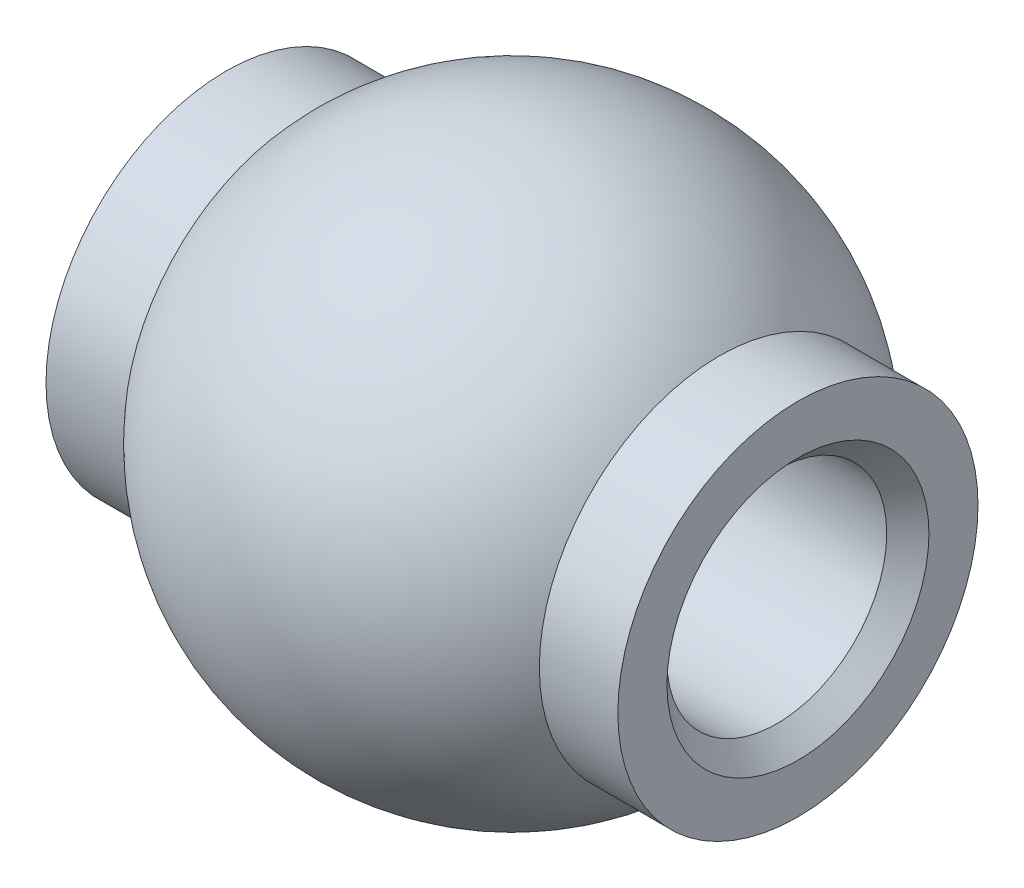
ISO-10303-21;
HEADER;
FILE_DESCRIPTION(('STEP AP214'),'2;1');
FILE_NAME('part.step','',(''),(''),'','','');
FILE_SCHEMA(('AUTOMOTIVE_DESIGN { 1 0 10303 214 1 1 1 1 }'));
ENDSEC;
DATA;
#1=APPLICATION_CONTEXT('core data for automotive mechanical design processes');
#2=APPLICATION_PROTOCOL_DEFINITION('international standard','automotive_design',2000,#1);
#3=PRODUCT_CONTEXT('',#1,'mechanical');
#4=PRODUCT('Part','Part','',(#3));
#5=PRODUCT_RELATED_PRODUCT_CATEGORY('part','',(#4));
#6=PRODUCT_DEFINITION_FORMATION('','',#4);
#7=PRODUCT_DEFINITION_CONTEXT('part definition',#1,'design');
#8=PRODUCT_DEFINITION('design','',#6,#7);
#9=PRODUCT_DEFINITION_SHAPE('','',#8);
#10=(LENGTH_UNIT() NAMED_UNIT(*) SI_UNIT(.MILLI.,.METRE.));
#11=(NAMED_UNIT(*) PLANE_ANGLE_UNIT() SI_UNIT($,.RADIAN.));
#12=(NAMED_UNIT(*) SI_UNIT($,.STERADIAN.) SOLID_ANGLE_UNIT());
#13=UNCERTAINTY_MEASURE_WITH_UNIT(LENGTH_MEASURE(1.E-05),#10,'distance_accuracy_value','');
#14=(GEOMETRIC_REPRESENTATION_CONTEXT(3) GLOBAL_UNCERTAINTY_ASSIGNED_CONTEXT((#13)) GLOBAL_UNIT_ASSIGNED_CONTEXT((#10,
#11,#12)) REPRESENTATION_CONTEXT('',''));
#15=CARTESIAN_POINT('',(0.,0.,0.));
#16=DIRECTION('',(0.,0.,1.));
#17=DIRECTION('',(1.,0.,0.));
#18=AXIS2_PLACEMENT_3D('',#15,#16,#17);
#19=CARTESIAN_POINT('',(-18.1576372828576,0.,0.));
#20=DIRECTION('',(-1.,0.,0.));
#21=DIRECTION('',(0.,0.,1.));
#22=AXIS2_PLACEMENT_3D('',#19,#20,#21);
#23=CYLINDRICAL_SURFACE('',#22,6.5024);
#24=CARTESIAN_POINT('',(-10.3251,0.,0.));
#25=DIRECTION('',(-1.,0.,0.));
#26=DIRECTION('',(0.,0.,1.));
#27=AXIS2_PLACEMENT_3D('',#24,#25,#26);
#28=CIRCLE('',#27,6.5024);
#29=CARTESIAN_POINT('',(-10.3251,0.,6.5024));
#30=VERTEX_POINT('',#29);
#31=EDGE_CURVE('E60',#30,#30,#28,.T.);
#32=ORIENTED_EDGE('',*,*,#31,.F.);
#33=EDGE_LOOP('',(#32));
#34=FACE_BOUND('',#33,.T.);
#35=CARTESIAN_POINT('',(-7.4899535332337,0.,0.));
#36=DIRECTION('',(-1.,0.,0.));
#37=DIRECTION('',(0.,0.,1.));
#38=AXIS2_PLACEMENT_3D('',#35,#36,#37);
#39=CIRCLE('',#38,6.5024);
#40=CARTESIAN_POINT('',(-7.4899535332337,6.5024,0.));
#41=VERTEX_POINT('',#40);
#42=EDGE_CURVE('E10',#41,#41,#39,.T.);
#43=ORIENTED_EDGE('',*,*,#42,.T.);
#44=EDGE_LOOP('',(#43));
#45=FACE_BOUND('',#44,.T.);
#46=ADVANCED_FACE('F32',(#34,#45),#23,.T.);
#47=CARTESIAN_POINT('',(0.,0.,0.));
#48=DIRECTION('',(-1.,0.,0.));
#49=DIRECTION('',(0.,1.,0.));
#50=AXIS2_PLACEMENT_3D('',#47,#48,#49);
#51=SPHERICAL_SURFACE('',#50,9.9187);
#52=CARTESIAN_POINT('',(7.4899535332337,0.,0.));
#53=DIRECTION('',(-1.,0.,0.));
#54=DIRECTION('',(0.,0.,1.));
#55=AXIS2_PLACEMENT_3D('',#52,#53,#54);
#56=CIRCLE('',#55,6.5024);
#57=CARTESIAN_POINT('',(7.4899535332337,6.5024,0.));
#58=VERTEX_POINT('',#57);
#59=EDGE_CURVE('E38',#58,#58,#56,.T.);
#60=CARTESIAN_POINT('',(-7.4899535332337,6.5024,0.));
#61=CARTESIAN_POINT('',(-7.37401661183817,6.63595227202198,0.));
#62=CARTESIAN_POINT('',(-7.25450093948191,6.76639705686018,0.));
#63=CARTESIAN_POINT('',(-7.00866932481816,7.02071332826354,0.));
#64=CARTESIAN_POINT('',(-6.88235338251067,7.1445848148287,0.));
#65=CARTESIAN_POINT('',(-6.62327845991468,7.38539616578054,0.));
#66=CARTESIAN_POINT('',(-6.49051947962619,7.50233603016721,0.));
#67=CARTESIAN_POINT('',(-6.21893935659771,7.72895068009894,0.));
#68=CARTESIAN_POINT('',(-6.08011821385773,7.83862546564399,0.));
#69=CARTESIAN_POINT('',(-5.79681058638008,8.05039593386584,0.));
#70=CARTESIAN_POINT('',(-5.65232410164241,8.15249161654265,0.));
#71=CARTESIAN_POINT('',(-5.35809919129269,8.34881189773743,0.));
#72=CARTESIAN_POINT('',(-5.20836076568064,8.44303649625542,0.));
#73=CARTESIAN_POINT('',(-4.90406029827689,8.62334504715407,0.));
#74=CARTESIAN_POINT('',(-4.74949825648517,8.70942899953474,0.));
#75=CARTESIAN_POINT('',(-4.43599270685566,8.87321000951006,0.));
#76=CARTESIAN_POINT('',(-4.27704919901786,8.95090706710471,0.));
#77=CARTESIAN_POINT('',(-3.95523539397332,9.09769202368348,0.));
#78=CARTESIAN_POINT('',(-3.79236509676657,9.1667799226676,0.));
#79=CARTESIAN_POINT('',(-3.46316362467276,9.29614892766297,0.));
#80=CARTESIAN_POINT('',(-3.29683244978569,9.35643003367423,0.));
#81=CARTESIAN_POINT('',(-2.96118503378543,9.46801301081764,0.));
#82=CARTESIAN_POINT('',(-2.79186879267225,9.51931488194981,0.));
#83=CARTESIAN_POINT('',(-2.45073559497558,9.61279263381059,0.));
#84=CARTESIAN_POINT('',(-2.27891863839209,9.65496851453921,0.));
#85=CARTESIAN_POINT('',(-1.9332755140894,9.73007363609334,0.));
#86=CARTESIAN_POINT('',(-1.7594493463702,9.76300287691885,0.));
#87=CARTESIAN_POINT('',(-1.41028505174561,9.81952052037092,0.));
#88=CARTESIAN_POINT('',(-1.23494692484022,9.84310892299747,0.));
#89=CARTESIAN_POINT('',(-0.88326028894244,9.88087741241351,0.));
#90=CARTESIAN_POINT('',(-0.706911779950046,9.895057499203,0.));
#91=CARTESIAN_POINT('',(-0.353708847305101,9.91396879299624,0.));
#92=CARTESIAN_POINT('',(-0.176854423652551,9.9187,0.));
#93=CARTESIAN_POINT('',(0.176854423652551,9.9187,0.));
#94=CARTESIAN_POINT('',(0.353708847305101,9.91396879299624,0.));
#95=CARTESIAN_POINT('',(0.706911779950046,9.895057499203,0.));
#96=CARTESIAN_POINT('',(0.88326028894244,9.88087741241351,0.));
#97=CARTESIAN_POINT('',(1.23494692484022,9.84310892299747,0.));
#98=CARTESIAN_POINT('',(1.41028505174561,9.81952052037092,0.));
#99=CARTESIAN_POINT('',(1.7594493463702,9.76300287691885,0.));
#100=CARTESIAN_POINT('',(1.9332755140894,9.73007363609334,0.));
#101=CARTESIAN_POINT('',(2.27891863839209,9.65496851453921,0.));
#102=CARTESIAN_POINT('',(2.45073559497558,9.61279263381059,0.));
#103=CARTESIAN_POINT('',(2.79186879267225,9.51931488194981,0.));
#104=CARTESIAN_POINT('',(2.96118503378543,9.46801301081764,0.));
#105=CARTESIAN_POINT('',(3.29683244978569,9.35643003367422,0.));
#106=CARTESIAN_POINT('',(3.46316362467276,9.29614892766297,0.));
#107=CARTESIAN_POINT('',(3.79236509676657,9.1667799226676,0.));
#108=CARTESIAN_POINT('',(3.95523539397332,9.09769202368348,0.));
#109=CARTESIAN_POINT('',(4.27704919901786,8.95090706710471,0.));
#110=CARTESIAN_POINT('',(4.43599270685566,8.87321000951006,0.));
#111=CARTESIAN_POINT('',(4.74949825648517,8.70942899953474,0.));
#112=CARTESIAN_POINT('',(4.90406029827689,8.62334504715407,0.));
#113=CARTESIAN_POINT('',(5.20836076568064,8.44303649625542,0.));
#114=CARTESIAN_POINT('',(5.35809919129269,8.34881189773743,0.));
#115=CARTESIAN_POINT('',(5.65232410164241,8.15249161654265,0.));
#116=CARTESIAN_POINT('',(5.79681058638008,8.05039593386584,0.));
#117=CARTESIAN_POINT('',(6.08011821385773,7.83862546564399,0.));
#118=CARTESIAN_POINT('',(6.21893935659771,7.72895068009894,0.));
#119=CARTESIAN_POINT('',(6.49051947962619,7.50233603016722,0.));
#120=CARTESIAN_POINT('',(6.62327845991468,7.38539616578054,0.));
#121=CARTESIAN_POINT('',(6.88235338251067,7.1445848148287,0.));
#122=CARTESIAN_POINT('',(7.00866932481816,7.02071332826354,0.));
#123=CARTESIAN_POINT('',(7.25450093948191,6.76639705686018,0.));
#124=CARTESIAN_POINT('',(7.37401661183817,6.63595227202198,0.));
#125=CARTESIAN_POINT('',(7.4899535332337,6.5024,0.));
#126=B_SPLINE_CURVE_WITH_KNOTS('',3,(#60,#61,#62,#63,#64,#65,#66,#67,#68,#69,#70,#71,#72,#73,
#74,#75,#76,#77,#78,#79,#80,#81,#82,#83,#84,#85,#86,#87,#88,#89,#90,#91,#92,#93,#94,#95,#96,#97,
#98,#99,#100,#101,#102,#103,#104,#105,#106,#107,#108,#109,#110,#111,#112,#113,#114,#115,#116,
#117,#118,#119,#120,#121,#122,#123,#124,#125),.UNSPECIFIED.,.F.,.F.,(4,2,2,2,2,2,2,2,2,2,2,2,2,
2,2,2,2,2,2,2,2,2,2,2,2,2,2,2,2,2,2,2,4),(0.,0.530500042943793,1.06100008588759,
1.59150012883138,2.12200017177517,2.65250021471897,3.18300025766276,3.71350030060655,
4.24400034355034,4.77450038649414,5.30500042943793,5.83550047238173,6.36600051532552,
6.89650055826931,7.4270006012131,7.9575006441569,8.48800068710069,9.01850073004448,
9.54900077298828,10.0795008159321,10.6100008588759,11.1405009018197,11.6710009447635,
12.2015009877072,12.732001030651,13.2625010735948,13.7930011165386,14.3235011594824,
14.8540012024262,15.38450124537,15.9150012883138,16.4455013312576,16.9760013742014),.UNSPECIFIED.);
#127=EDGE_CURVE('BSEAM67',#41,#58,#126,.T.);
#128=ORIENTED_EDGE('',*,*,#42,.F.);
#129=ORIENTED_EDGE('',*,*,#59,.T.);
#130=ORIENTED_EDGE('',*,*,#127,.T.);
#131=ORIENTED_EDGE('',*,*,#127,.F.);
#132=EDGE_LOOP('',(#128,#130,#129,#131));
#133=FACE_BOUND('',#132,.T.);
#134=ADVANCED_FACE('F67',(#133),#51,.T.);
#135=CARTESIAN_POINT('',(-18.1576372828576,0.,0.));
#136=DIRECTION('',(-1.,0.,0.));
#137=DIRECTION('',(0.,0.,1.));
#138=AXIS2_PLACEMENT_3D('',#135,#136,#137);
#139=CYLINDRICAL_SURFACE('',#138,6.5024);
#140=ORIENTED_EDGE('',*,*,#59,.F.);
#141=EDGE_LOOP('',(#140));
#142=FACE_BOUND('',#141,.T.);
#143=CARTESIAN_POINT('',(10.3251,0.,0.));
#144=DIRECTION('',(-1.,0.,0.));
#145=DIRECTION('',(0.,0.,1.));
#146=AXIS2_PLACEMENT_3D('',#143,#144,#145);
#147=CIRCLE('',#146,6.5024);
#148=CARTESIAN_POINT('',(10.3251,0.,6.5024));
#149=VERTEX_POINT('',#148);
#150=EDGE_CURVE('E42',#149,#149,#147,.T.);
#151=ORIENTED_EDGE('',*,*,#150,.T.);
#152=EDGE_LOOP('',(#151));
#153=FACE_BOUND('',#152,.T.);
#154=ADVANCED_FACE('F71',(#142,#153),#139,.T.);
#155=CARTESIAN_POINT('',(10.3251,4.73075,0.));
#156=DIRECTION('',(-1.,0.,0.));
#157=DIRECTION('',(0.,0.,1.));
#158=AXIS2_PLACEMENT_3D('',#155,#156,#157);
#159=PLANE('',#158);
#160=ORIENTED_EDGE('',*,*,#150,.F.);
#161=EDGE_LOOP('',(#160));
#162=FACE_BOUND('',#161,.T.);
#163=CARTESIAN_POINT('',(10.3251,0.,0.));
#164=DIRECTION('',(-1.,0.,0.));
#165=DIRECTION('',(0.,0.,1.));
#166=AXIS2_PLACEMENT_3D('',#163,#164,#165);
#167=CIRCLE('',#166,4.73075);
#168=CARTESIAN_POINT('',(10.3251,0.,4.73075));
#169=VERTEX_POINT('',#168);
#170=EDGE_CURVE('E46',#169,#169,#167,.T.);
#171=ORIENTED_EDGE('',*,*,#170,.T.);
#172=EDGE_LOOP('',(#171));
#173=FACE_BOUND('',#172,.T.);
#174=ADVANCED_FACE('F76',(#162,#173),#159,.F.);
#175=CARTESIAN_POINT('',(9.5631,0.,0.));
#176=DIRECTION('',(1.,0.,0.));
#177=DIRECTION('',(0.,0.,-1.));
#178=AXIS2_PLACEMENT_3D('',#175,#176,#177);
#179=CONICAL_SURFACE('',#178,3.96875,0.785398163397444);
#180=ORIENTED_EDGE('',*,*,#170,.F.);
#181=EDGE_LOOP('',(#180));
#182=FACE_BOUND('',#181,.T.);
#183=CARTESIAN_POINT('',(9.5631,0.,0.));
#184=DIRECTION('',(-1.,0.,0.));
#185=DIRECTION('',(0.,0.,1.));
#186=AXIS2_PLACEMENT_3D('',#183,#184,#185);
#187=CIRCLE('',#186,3.96875);
#188=CARTESIAN_POINT('',(9.5631,0.,3.96875));
#189=VERTEX_POINT('',#188);
#190=EDGE_CURVE('E51',#189,#189,#187,.T.);
#191=ORIENTED_EDGE('',*,*,#190,.T.);
#192=EDGE_LOOP('',(#191));
#193=FACE_BOUND('',#192,.T.);
#194=ADVANCED_FACE('F82',(#182,#193),#179,.F.);
#195=CARTESIAN_POINT('',(-18.1576372828576,0.,0.));
#196=DIRECTION('',(-1.,0.,0.));
#197=DIRECTION('',(0.,0.,1.));
#198=AXIS2_PLACEMENT_3D('',#195,#196,#197);
#199=CYLINDRICAL_SURFACE('',#198,3.96875);
#200=ORIENTED_EDGE('',*,*,#190,.F.);
#201=EDGE_LOOP('',(#200));
#202=FACE_BOUND('',#201,.T.);
#203=CARTESIAN_POINT('',(-9.5631,0.,0.));
#204=DIRECTION('',(-1.,0.,0.));
#205=DIRECTION('',(0.,0.,1.));
#206=AXIS2_PLACEMENT_3D('',#203,#204,#205);
#207=CIRCLE('',#206,3.96875);
#208=CARTESIAN_POINT('',(-9.5631,0.,3.96875));
#209=VERTEX_POINT('',#208);
#210=EDGE_CURVE('E54',#209,#209,#207,.T.);
#211=ORIENTED_EDGE('',*,*,#210,.T.);
#212=EDGE_LOOP('',(#211));
#213=FACE_BOUND('',#212,.T.);
#214=ADVANCED_FACE('F86',(#202,#213),#199,.F.);
#215=CARTESIAN_POINT('',(-10.3251,0.,0.));
#216=DIRECTION('',(-1.,0.,0.));
#217=DIRECTION('',(0.,0.,1.));
#218=AXIS2_PLACEMENT_3D('',#215,#216,#217);
#219=CONICAL_SURFACE('',#218,4.73075,0.78539816339745);
#220=ORIENTED_EDGE('',*,*,#210,.F.);
#221=EDGE_LOOP('',(#220));
#222=FACE_BOUND('',#221,.T.);
#223=CARTESIAN_POINT('',(-10.3251,0.,0.));
#224=DIRECTION('',(-1.,0.,0.));
#225=DIRECTION('',(0.,0.,1.));
#226=AXIS2_PLACEMENT_3D('',#223,#224,#225);
#227=CIRCLE('',#226,4.73075);
#228=CARTESIAN_POINT('',(-10.3251,0.,4.73075));
#229=VERTEX_POINT('',#228);
#230=EDGE_CURVE('E57',#229,#229,#227,.T.);
#231=ORIENTED_EDGE('',*,*,#230,.T.);
#232=EDGE_LOOP('',(#231));
#233=FACE_BOUND('',#232,.T.);
#234=ADVANCED_FACE('F90',(#222,#233),#219,.F.);
#235=CARTESIAN_POINT('',(-10.3251,6.5024,0.));
#236=DIRECTION('',(1.,0.,0.));
#237=DIRECTION('',(0.,0.,-1.));
#238=AXIS2_PLACEMENT_3D('',#235,#236,#237);
#239=PLANE('',#238);
#240=ORIENTED_EDGE('',*,*,#230,.F.);
#241=EDGE_LOOP('',(#240));
#242=FACE_BOUND('',#241,.T.);
#243=ORIENTED_EDGE('',*,*,#31,.T.);
#244=EDGE_LOOP('',(#243));
#245=FACE_BOUND('',#244,.T.);
#246=ADVANCED_FACE('F64',(#242,#245),#239,.F.);
#247=CLOSED_SHELL('',(#46,#134,#154,#174,#194,#214,#234,#246));
#248=MANIFOLD_SOLID_BREP('B2',#247);
#249=ADVANCED_BREP_SHAPE_REPRESENTATION('',(#18,#248),#14);
#250=SHAPE_DEFINITION_REPRESENTATION(#9,#249);
ENDSEC;
END-ISO-10303-21;
